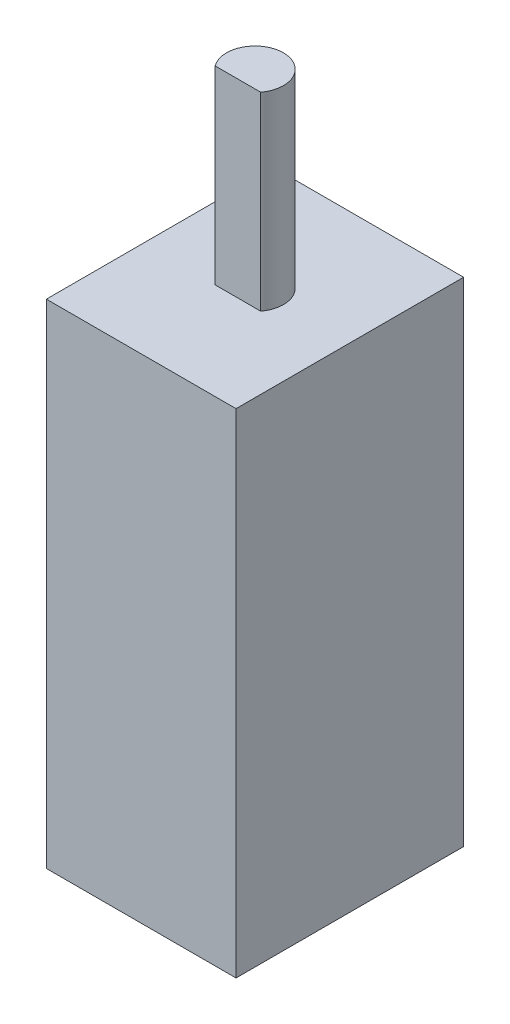
ISO-10303-21;
HEADER;
FILE_DESCRIPTION(('STEP AP214'),'2;1');
FILE_NAME('part.step','',(''),(''),'','','');
FILE_SCHEMA(('AUTOMOTIVE_DESIGN { 1 0 10303 214 1 1 1 1 }'));
ENDSEC;
DATA;
#1=APPLICATION_CONTEXT('core data for automotive mechanical design processes');
#2=APPLICATION_PROTOCOL_DEFINITION('international standard','automotive_design',2000,#1);
#3=PRODUCT_CONTEXT('',#1,'mechanical');
#4=PRODUCT('Part','Part','',(#3));
#5=PRODUCT_RELATED_PRODUCT_CATEGORY('part','',(#4));
#6=PRODUCT_DEFINITION_FORMATION('','',#4);
#7=PRODUCT_DEFINITION_CONTEXT('part definition',#1,'design');
#8=PRODUCT_DEFINITION('design','',#6,#7);
#9=PRODUCT_DEFINITION_SHAPE('','',#8);
#10=(LENGTH_UNIT() NAMED_UNIT(*) SI_UNIT(.MILLI.,.METRE.));
#11=(NAMED_UNIT(*) PLANE_ANGLE_UNIT() SI_UNIT($,.RADIAN.));
#12=(NAMED_UNIT(*) SI_UNIT($,.STERADIAN.) SOLID_ANGLE_UNIT());
#13=UNCERTAINTY_MEASURE_WITH_UNIT(LENGTH_MEASURE(1.E-05),#10,'distance_accuracy_value','');
#14=(GEOMETRIC_REPRESENTATION_CONTEXT(3) GLOBAL_UNCERTAINTY_ASSIGNED_CONTEXT((#13)) GLOBAL_UNIT_ASSIGNED_CONTEXT((#10,
#11,#12)) REPRESENTATION_CONTEXT('',''));
#15=CARTESIAN_POINT('',(0.,0.,0.));
#16=DIRECTION('',(0.,0.,1.));
#17=DIRECTION('',(1.,0.,0.));
#18=AXIS2_PLACEMENT_3D('',#15,#16,#17);
#19=CARTESIAN_POINT('',(5.,26.,-6.));
#20=DIRECTION('',(-1.,0.,0.));
#21=DIRECTION('',(0.,0.,1.));
#22=AXIS2_PLACEMENT_3D('',#19,#20,#21);
#23=PLANE('',#22);
#24=DIRECTION('',(0.,0.,-1.));
#25=VECTOR('',#24,1.);
#26=CARTESIAN_POINT('',(5.,0.,-6.));
#27=LINE('',#26,#25);
#28=CARTESIAN_POINT('',(5.,0.,6.));
#29=VERTEX_POINT('',#28);
#30=CARTESIAN_POINT('',(5.,0.,-6.));
#31=VERTEX_POINT('',#30);
#32=EDGE_CURVE('E115',#29,#31,#27,.T.);
#33=ORIENTED_EDGE('',*,*,#32,.T.);
#34=DIRECTION('',(0.,-1.,0.));
#35=VECTOR('',#34,1.);
#36=CARTESIAN_POINT('',(5.,26.,-6.));
#37=LINE('',#36,#35);
#38=CARTESIAN_POINT('',(5.,26.,-6.));
#39=VERTEX_POINT('',#38);
#40=EDGE_CURVE('E11',#39,#31,#37,.T.);
#41=ORIENTED_EDGE('',*,*,#40,.F.);
#42=DIRECTION('',(0.,0.,-1.));
#43=VECTOR('',#42,1.);
#44=CARTESIAN_POINT('',(5.,26.,-6.));
#45=LINE('',#44,#43);
#46=CARTESIAN_POINT('',(5.,26.,6.));
#47=VERTEX_POINT('',#46);
#48=EDGE_CURVE('E123',#47,#39,#45,.T.);
#49=ORIENTED_EDGE('',*,*,#48,.F.);
#50=DIRECTION('',(0.,-1.,0.));
#51=VECTOR('',#50,1.);
#52=CARTESIAN_POINT('',(5.,26.,6.));
#53=LINE('',#52,#51);
#54=EDGE_CURVE('E128',#47,#29,#53,.T.);
#55=ORIENTED_EDGE('',*,*,#54,.T.);
#56=EDGE_LOOP('',(#33,#41,#49,#55));
#57=FACE_BOUND('',#56,.T.);
#58=ADVANCED_FACE('F38',(#57),#23,.F.);
#59=CARTESIAN_POINT('',(-5.,26.,-6.));
#60=DIRECTION('',(0.,0.,1.));
#61=DIRECTION('',(1.,0.,0.));
#62=AXIS2_PLACEMENT_3D('',#59,#60,#61);
#63=PLANE('',#62);
#64=DIRECTION('',(-1.,0.,0.));
#65=VECTOR('',#64,1.);
#66=CARTESIAN_POINT('',(-5.,0.,-6.));
#67=LINE('',#66,#65);
#68=CARTESIAN_POINT('',(-5.,0.,-6.));
#69=VERTEX_POINT('',#68);
#70=EDGE_CURVE('E118',#31,#69,#67,.T.);
#71=ORIENTED_EDGE('',*,*,#70,.T.);
#72=DIRECTION('',(0.,-1.,0.));
#73=VECTOR('',#72,1.);
#74=CARTESIAN_POINT('',(-5.,26.,-6.));
#75=LINE('',#74,#73);
#76=CARTESIAN_POINT('',(-5.,26.,-6.));
#77=VERTEX_POINT('',#76);
#78=EDGE_CURVE('E45',#77,#69,#75,.T.);
#79=ORIENTED_EDGE('',*,*,#78,.F.);
#80=DIRECTION('',(-1.,0.,0.));
#81=VECTOR('',#80,1.);
#82=CARTESIAN_POINT('',(-5.,26.,-6.));
#83=LINE('',#82,#81);
#84=EDGE_CURVE('E88',#39,#77,#83,.T.);
#85=ORIENTED_EDGE('',*,*,#84,.F.);
#86=ORIENTED_EDGE('',*,*,#40,.T.);
#87=EDGE_LOOP('',(#71,#79,#85,#86));
#88=FACE_BOUND('',#87,.T.);
#89=ADVANCED_FACE('F157',(#88),#63,.F.);
#90=CARTESIAN_POINT('',(-5.,26.,-6.));
#91=DIRECTION('',(1.,0.,0.));
#92=DIRECTION('',(0.,0.,-1.));
#93=AXIS2_PLACEMENT_3D('',#90,#91,#92);
#94=PLANE('',#93);
#95=DIRECTION('',(0.,0.,1.));
#96=VECTOR('',#95,1.);
#97=CARTESIAN_POINT('',(-5.,0.,-6.));
#98=LINE('',#97,#96);
#99=CARTESIAN_POINT('',(-5.,0.,6.));
#100=VERTEX_POINT('',#99);
#101=EDGE_CURVE('E131',#69,#100,#98,.T.);
#102=ORIENTED_EDGE('',*,*,#101,.T.);
#103=DIRECTION('',(0.,-1.,0.));
#104=VECTOR('',#103,1.);
#105=CARTESIAN_POINT('',(-5.,26.,6.));
#106=LINE('',#105,#104);
#107=CARTESIAN_POINT('',(-5.,26.,6.));
#108=VERTEX_POINT('',#107);
#109=EDGE_CURVE('E135',#108,#100,#106,.T.);
#110=ORIENTED_EDGE('',*,*,#109,.F.);
#111=DIRECTION('',(0.,0.,1.));
#112=VECTOR('',#111,1.);
#113=CARTESIAN_POINT('',(-5.,26.,-6.));
#114=LINE('',#113,#112);
#115=EDGE_CURVE('E126',#77,#108,#114,.T.);
#116=ORIENTED_EDGE('',*,*,#115,.F.);
#117=ORIENTED_EDGE('',*,*,#78,.T.);
#118=EDGE_LOOP('',(#102,#110,#116,#117));
#119=FACE_BOUND('',#118,.T.);
#120=ADVANCED_FACE('F140',(#119),#94,.F.);
#121=CARTESIAN_POINT('',(-5.,26.,6.));
#122=DIRECTION('',(0.,0.,-1.));
#123=DIRECTION('',(-1.,0.,0.));
#124=AXIS2_PLACEMENT_3D('',#121,#122,#123);
#125=PLANE('',#124);
#126=DIRECTION('',(1.,0.,0.));
#127=VECTOR('',#126,1.);
#128=CARTESIAN_POINT('',(-5.,0.,6.));
#129=LINE('',#128,#127);
#130=EDGE_CURVE('E81',#100,#29,#129,.T.);
#131=ORIENTED_EDGE('',*,*,#130,.T.);
#132=ORIENTED_EDGE('',*,*,#54,.F.);
#133=DIRECTION('',(1.,0.,0.));
#134=VECTOR('',#133,1.);
#135=CARTESIAN_POINT('',(-5.,26.,6.));
#136=LINE('',#135,#134);
#137=EDGE_CURVE('E60',#108,#47,#136,.T.);
#138=ORIENTED_EDGE('',*,*,#137,.F.);
#139=ORIENTED_EDGE('',*,*,#109,.T.);
#140=EDGE_LOOP('',(#131,#132,#138,#139));
#141=FACE_BOUND('',#140,.T.);
#142=ADVANCED_FACE('F148',(#141),#125,.F.);
#143=CARTESIAN_POINT('',(0.,26.,0.));
#144=DIRECTION('',(0.,1.,0.));
#145=DIRECTION('',(0.,0.,1.));
#146=AXIS2_PLACEMENT_3D('',#143,#144,#145);
#147=PLANE('',#146);
#148=DIRECTION('',(1.,0.,0.));
#149=VECTOR('',#148,1.);
#150=CARTESIAN_POINT('',(0.,26.,0.9));
#151=LINE('',#150,#149);
#152=CARTESIAN_POINT('',(-1.2,26.,0.9));
#153=VERTEX_POINT('',#152);
#154=CARTESIAN_POINT('',(1.2,26.,0.9));
#155=VERTEX_POINT('',#154);
#156=EDGE_CURVE('E114',#153,#155,#151,.T.);
#157=ORIENTED_EDGE('',*,*,#156,.F.);
#158=CARTESIAN_POINT('',(0.,26.,0.));
#159=DIRECTION('',(0.,1.,0.));
#160=DIRECTION('',(0.,0.,1.));
#161=AXIS2_PLACEMENT_3D('',#158,#159,#160);
#162=CIRCLE('',#161,1.5);
#163=EDGE_CURVE('E51',#155,#153,#162,.T.);
#164=ORIENTED_EDGE('',*,*,#163,.F.);
#165=EDGE_LOOP('',(#157,#164));
#166=FACE_BOUND('',#165,.T.);
#167=ORIENTED_EDGE('',*,*,#48,.T.);
#168=ORIENTED_EDGE('',*,*,#84,.T.);
#169=ORIENTED_EDGE('',*,*,#115,.T.);
#170=ORIENTED_EDGE('',*,*,#137,.T.);
#171=EDGE_LOOP('',(#167,#168,#169,#170));
#172=FACE_BOUND('',#171,.T.);
#173=ADVANCED_FACE('F150',(#166,#172),#147,.T.);
#174=CARTESIAN_POINT('',(0.,0.,0.));
#175=DIRECTION('',(0.,1.,0.));
#176=DIRECTION('',(0.,0.,1.));
#177=AXIS2_PLACEMENT_3D('',#174,#175,#176);
#178=PLANE('',#177);
#179=ORIENTED_EDGE('',*,*,#32,.F.);
#180=ORIENTED_EDGE('',*,*,#130,.F.);
#181=ORIENTED_EDGE('',*,*,#101,.F.);
#182=ORIENTED_EDGE('',*,*,#70,.F.);
#183=EDGE_LOOP('',(#179,#180,#181,#182));
#184=FACE_BOUND('',#183,.T.);
#185=ADVANCED_FACE('F144',(#184),#178,.F.);
#186=CARTESIAN_POINT('',(0.,36.,0.9));
#187=DIRECTION('',(0.,0.,-1.));
#188=DIRECTION('',(-1.,0.,0.));
#189=AXIS2_PLACEMENT_3D('',#186,#187,#188);
#190=PLANE('',#189);
#191=ORIENTED_EDGE('',*,*,#156,.T.);
#192=DIRECTION('',(0.,-1.,0.));
#193=VECTOR('',#192,1.);
#194=CARTESIAN_POINT('',(1.2,36.,0.9));
#195=LINE('',#194,#193);
#196=CARTESIAN_POINT('',(1.2,36.,0.9));
#197=VERTEX_POINT('',#196);
#198=EDGE_CURVE('E102',#197,#155,#195,.T.);
#199=ORIENTED_EDGE('',*,*,#198,.F.);
#200=DIRECTION('',(1.,0.,0.));
#201=VECTOR('',#200,1.);
#202=CARTESIAN_POINT('',(0.,36.,0.9));
#203=LINE('',#202,#201);
#204=CARTESIAN_POINT('',(-1.2,36.,0.9));
#205=VERTEX_POINT('',#204);
#206=EDGE_CURVE('E108',#205,#197,#203,.T.);
#207=ORIENTED_EDGE('',*,*,#206,.F.);
#208=DIRECTION('',(0.,-1.,0.));
#209=VECTOR('',#208,1.);
#210=CARTESIAN_POINT('',(-1.2,36.,0.9));
#211=LINE('',#210,#209);
#212=EDGE_CURVE('E105',#205,#153,#211,.T.);
#213=ORIENTED_EDGE('',*,*,#212,.T.);
#214=EDGE_LOOP('',(#191,#199,#207,#213));
#215=FACE_BOUND('',#214,.T.);
#216=ADVANCED_FACE('F113',(#215),#190,.F.);
#217=CARTESIAN_POINT('',(0.,36.,0.));
#218=DIRECTION('',(0.,-1.,0.));
#219=DIRECTION('',(0.,0.,-1.));
#220=AXIS2_PLACEMENT_3D('',#217,#218,#219);
#221=CYLINDRICAL_SURFACE('',#220,1.5);
#222=ORIENTED_EDGE('',*,*,#163,.T.);
#223=ORIENTED_EDGE('',*,*,#212,.F.);
#224=CARTESIAN_POINT('',(0.,36.,0.));
#225=DIRECTION('',(0.,1.,0.));
#226=DIRECTION('',(0.,0.,1.));
#227=AXIS2_PLACEMENT_3D('',#224,#225,#226);
#228=CIRCLE('',#227,1.5);
#229=EDGE_CURVE('E98',#197,#205,#228,.T.);
#230=ORIENTED_EDGE('',*,*,#229,.F.);
#231=ORIENTED_EDGE('',*,*,#198,.T.);
#232=EDGE_LOOP('',(#222,#223,#230,#231));
#233=FACE_BOUND('',#232,.T.);
#234=ADVANCED_FACE('F100',(#233),#221,.T.);
#235=CARTESIAN_POINT('',(0.,36.,0.));
#236=DIRECTION('',(0.,1.,0.));
#237=DIRECTION('',(0.,0.,1.));
#238=AXIS2_PLACEMENT_3D('',#235,#236,#237);
#239=PLANE('',#238);
#240=ORIENTED_EDGE('',*,*,#206,.T.);
#241=ORIENTED_EDGE('',*,*,#229,.T.);
#242=EDGE_LOOP('',(#240,#241));
#243=FACE_BOUND('',#242,.T.);
#244=ADVANCED_FACE('F110',(#243),#239,.T.);
#245=CLOSED_SHELL('',(#58,#89,#120,#142,#173,#185,#216,#234,#244));
#246=MANIFOLD_SOLID_BREP('B2',#245);
#247=ADVANCED_BREP_SHAPE_REPRESENTATION('',(#18,#246),#14);
#248=SHAPE_DEFINITION_REPRESENTATION(#9,#247);
ENDSEC;
END-ISO-10303-21;
